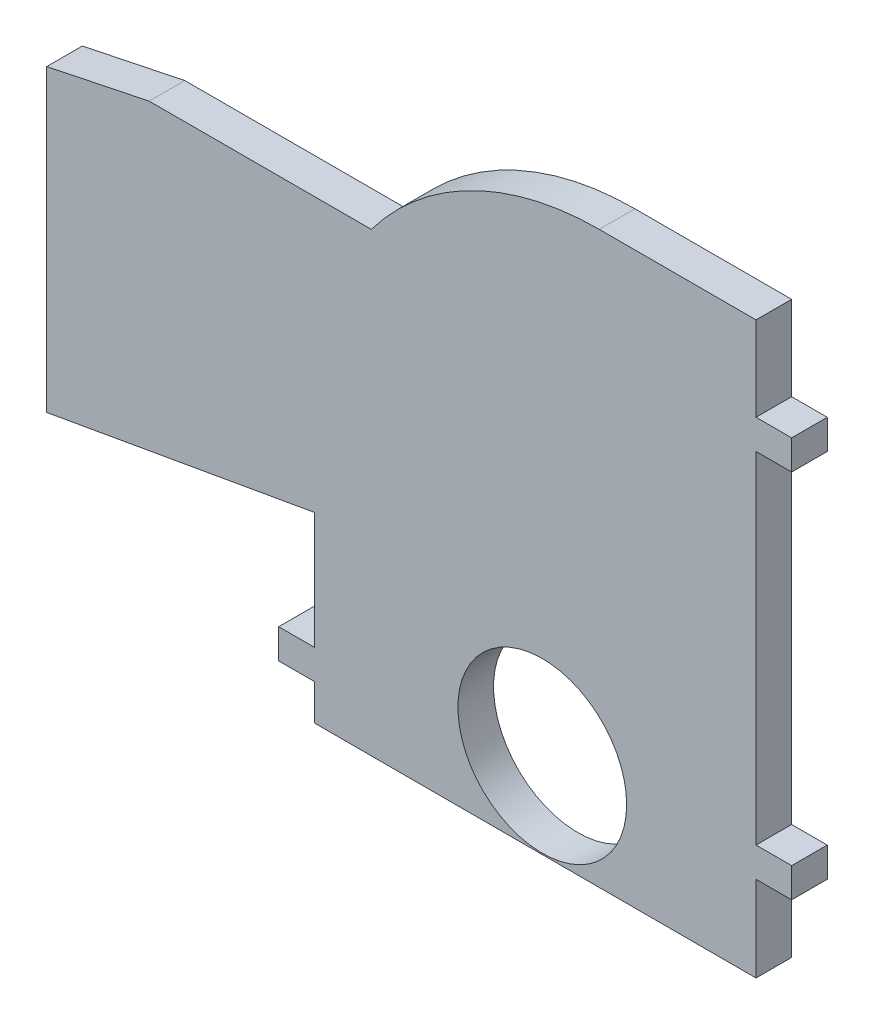
ISO-10303-21;
HEADER;
FILE_DESCRIPTION(('STEP AP214'),'2;1');
FILE_NAME('part.step','',(''),(''),'','','');
FILE_SCHEMA(('AUTOMOTIVE_DESIGN { 1 0 10303 214 1 1 1 1 }'));
ENDSEC;
DATA;
#1=APPLICATION_CONTEXT('core data for automotive mechanical design processes');
#2=APPLICATION_PROTOCOL_DEFINITION('international standard','automotive_design',2000,#1);
#3=PRODUCT_CONTEXT('',#1,'mechanical');
#4=PRODUCT('Part','Part','',(#3));
#5=PRODUCT_RELATED_PRODUCT_CATEGORY('part','',(#4));
#6=PRODUCT_DEFINITION_FORMATION('','',#4);
#7=PRODUCT_DEFINITION_CONTEXT('part definition',#1,'design');
#8=PRODUCT_DEFINITION('design','',#6,#7);
#9=PRODUCT_DEFINITION_SHAPE('','',#8);
#10=(LENGTH_UNIT() NAMED_UNIT(*) SI_UNIT(.MILLI.,.METRE.));
#11=(NAMED_UNIT(*) PLANE_ANGLE_UNIT() SI_UNIT($,.RADIAN.));
#12=(NAMED_UNIT(*) SI_UNIT($,.STERADIAN.) SOLID_ANGLE_UNIT());
#13=UNCERTAINTY_MEASURE_WITH_UNIT(LENGTH_MEASURE(1.E-05),#10,'distance_accuracy_value','');
#14=(GEOMETRIC_REPRESENTATION_CONTEXT(3) GLOBAL_UNCERTAINTY_ASSIGNED_CONTEXT((#13)) GLOBAL_UNIT_ASSIGNED_CONTEXT((#10,
#11,#12)) REPRESENTATION_CONTEXT('',''));
#15=CARTESIAN_POINT('',(0.,0.,0.));
#16=DIRECTION('',(0.,0.,1.));
#17=DIRECTION('',(1.,0.,0.));
#18=AXIS2_PLACEMENT_3D('',#15,#16,#17);
#19=CARTESIAN_POINT('',(-5.14406367786522,21.59,1.5875));
#20=DIRECTION('',(0.,1.,0.));
#21=DIRECTION('',(-1.,0.,0.));
#22=AXIS2_PLACEMENT_3D('',#19,#20,#21);
#23=PLANE('',#22);
#24=DIRECTION('',(1.,0.,0.));
#25=VECTOR('',#24,1.);
#26=CARTESIAN_POINT('',(-5.14406367786522,21.59,0.));
#27=LINE('',#26,#25);
#28=CARTESIAN_POINT('',(2.53999999999987,21.59,0.));
#29=VERTEX_POINT('',#28);
#30=CARTESIAN_POINT('',(9.52499999999987,21.59,0.));
#31=VERTEX_POINT('',#30);
#32=EDGE_CURVE('E213',#29,#31,#27,.T.);
#33=ORIENTED_EDGE('',*,*,#32,.F.);
#34=DIRECTION('',(0.,0.,-1.));
#35=VECTOR('',#34,1.);
#36=CARTESIAN_POINT('',(2.53999999999987,21.59,1.5875));
#37=LINE('',#36,#35);
#38=CARTESIAN_POINT('',(2.53999999999987,21.59,1.5875));
#39=VERTEX_POINT('',#38);
#40=EDGE_CURVE('E11',#39,#29,#37,.T.);
#41=ORIENTED_EDGE('',*,*,#40,.F.);
#42=DIRECTION('',(1.,0.,0.));
#43=VECTOR('',#42,1.);
#44=CARTESIAN_POINT('',(-5.14406367786522,21.59,1.5875));
#45=LINE('',#44,#43);
#46=CARTESIAN_POINT('',(9.52499999999987,21.59,1.5875));
#47=VERTEX_POINT('',#46);
#48=EDGE_CURVE('E394',#39,#47,#45,.T.);
#49=ORIENTED_EDGE('',*,*,#48,.T.);
#50=DIRECTION('',(0.,0.,-1.));
#51=VECTOR('',#50,1.);
#52=CARTESIAN_POINT('',(9.52499999999987,21.59,1.5875));
#53=LINE('',#52,#51);
#54=EDGE_CURVE('E52',#47,#31,#53,.T.);
#55=ORIENTED_EDGE('',*,*,#54,.T.);
#56=EDGE_LOOP('',(#33,#41,#49,#55));
#57=FACE_BOUND('',#56,.T.);
#58=ADVANCED_FACE('F35',(#57),#23,.T.);
#59=CARTESIAN_POINT('',(2.53999999999988,8.89,1.5875));
#60=DIRECTION('',(0.,0.,-1.));
#61=DIRECTION('',(-1.,0.,0.));
#62=AXIS2_PLACEMENT_3D('',#59,#60,#61);
#63=CYLINDRICAL_SURFACE('',#62,12.7);
#64=CARTESIAN_POINT('',(2.53999999999988,8.89,0.));
#65=DIRECTION('',(0.,0.,1.));
#66=DIRECTION('',(1.,0.,0.));
#67=AXIS2_PLACEMENT_3D('',#64,#65,#66);
#68=CIRCLE('',#67,12.7);
#69=CARTESIAN_POINT('',(-7.62000000000013,16.51,0.));
#70=VERTEX_POINT('',#69);
#71=EDGE_CURVE('E215',#29,#70,#68,.T.);
#72=ORIENTED_EDGE('',*,*,#71,.T.);
#73=DIRECTION('',(0.,0.,-1.));
#74=VECTOR('',#73,1.);
#75=CARTESIAN_POINT('',(-7.62000000000013,16.51,1.5875));
#76=LINE('',#75,#74);
#77=CARTESIAN_POINT('',(-7.62000000000013,16.51,1.5875));
#78=VERTEX_POINT('',#77);
#79=EDGE_CURVE('E44',#78,#70,#76,.T.);
#80=ORIENTED_EDGE('',*,*,#79,.F.);
#81=CARTESIAN_POINT('',(2.53999999999988,8.89,1.5875));
#82=DIRECTION('',(0.,0.,1.));
#83=DIRECTION('',(1.,0.,0.));
#84=AXIS2_PLACEMENT_3D('',#81,#82,#83);
#85=CIRCLE('',#84,12.7);
#86=EDGE_CURVE('E396',#39,#78,#85,.T.);
#87=ORIENTED_EDGE('',*,*,#86,.F.);
#88=ORIENTED_EDGE('',*,*,#40,.T.);
#89=EDGE_LOOP('',(#72,#80,#87,#88));
#90=FACE_BOUND('',#89,.T.);
#91=ADVANCED_FACE('F313',(#90),#63,.T.);
#92=CARTESIAN_POINT('',(-5.14406367786526,16.51,1.5875));
#93=DIRECTION('',(0.,-1.,0.));
#94=DIRECTION('',(1.,0.,0.));
#95=AXIS2_PLACEMENT_3D('',#92,#93,#94);
#96=PLANE('',#95);
#97=DIRECTION('',(-1.,0.,0.));
#98=VECTOR('',#97,1.);
#99=CARTESIAN_POINT('',(-5.14406367786526,16.51,0.));
#100=LINE('',#99,#98);
#101=CARTESIAN_POINT('',(-17.5194607595146,16.51,0.));
#102=VERTEX_POINT('',#101);
#103=EDGE_CURVE('E218',#70,#102,#100,.T.);
#104=ORIENTED_EDGE('',*,*,#103,.T.);
#105=DIRECTION('',(0.,0.,-1.));
#106=VECTOR('',#105,1.);
#107=CARTESIAN_POINT('',(-17.5194607595146,16.51,1.5875));
#108=LINE('',#107,#106);
#109=CARTESIAN_POINT('',(-17.5194607595146,16.51,1.5875));
#110=VERTEX_POINT('',#109);
#111=EDGE_CURVE('E301',#110,#102,#108,.T.);
#112=ORIENTED_EDGE('',*,*,#111,.F.);
#113=DIRECTION('',(-1.,0.,0.));
#114=VECTOR('',#113,1.);
#115=CARTESIAN_POINT('',(-5.14406367786526,16.51,1.5875));
#116=LINE('',#115,#114);
#117=EDGE_CURVE('E309',#78,#110,#116,.T.);
#118=ORIENTED_EDGE('',*,*,#117,.F.);
#119=ORIENTED_EDGE('',*,*,#79,.T.);
#120=EDGE_LOOP('',(#104,#112,#118,#119));
#121=FACE_BOUND('',#120,.T.);
#122=ADVANCED_FACE('F306',(#121),#96,.F.);
#123=CARTESIAN_POINT('',(-13.8094341351268,17.2810529858588,1.5875));
#124=DIRECTION('',(0.203481459353994,-0.979078799535139,0.));
#125=DIRECTION('',(0.979078799535139,0.203481459353994,0.));
#126=AXIS2_PLACEMENT_3D('',#123,#124,#125);
#127=PLANE('',#126);
#128=DIRECTION('',(-0.979078799535139,-0.203481459353994,0.));
#129=VECTOR('',#128,1.);
#130=CARTESIAN_POINT('',(-13.8094341351268,17.2810529858588,0.));
#131=LINE('',#130,#129);
#132=CARTESIAN_POINT('',(-22.0849215190291,15.5611625638197,0.));
#133=VERTEX_POINT('',#132);
#134=EDGE_CURVE('E221',#102,#133,#131,.T.);
#135=ORIENTED_EDGE('',*,*,#134,.T.);
#136=DIRECTION('',(0.,0.,-1.));
#137=VECTOR('',#136,1.);
#138=CARTESIAN_POINT('',(-22.0849215190291,15.5611625638197,1.5875));
#139=LINE('',#138,#137);
#140=CARTESIAN_POINT('',(-22.0849215190291,15.5611625638197,1.5875));
#141=VERTEX_POINT('',#140);
#142=EDGE_CURVE('E299',#141,#133,#139,.T.);
#143=ORIENTED_EDGE('',*,*,#142,.F.);
#144=DIRECTION('',(-0.979078799535139,-0.203481459353994,0.));
#145=VECTOR('',#144,1.);
#146=CARTESIAN_POINT('',(-13.8094341351268,17.2810529858588,1.5875));
#147=LINE('',#146,#145);
#148=EDGE_CURVE('E401',#110,#141,#147,.T.);
#149=ORIENTED_EDGE('',*,*,#148,.F.);
#150=ORIENTED_EDGE('',*,*,#111,.T.);
#151=EDGE_LOOP('',(#135,#143,#149,#150));
#152=FACE_BOUND('',#151,.T.);
#153=ADVANCED_FACE('F325',(#152),#127,.F.);
#154=CARTESIAN_POINT('',(-22.0849215190291,-24.4135590527904,1.5875));
#155=DIRECTION('',(-1.,0.,0.));
#156=DIRECTION('',(0.,0.,1.));
#157=AXIS2_PLACEMENT_3D('',#154,#155,#156);
#158=PLANE('',#157);
#159=DIRECTION('',(0.,1.,0.));
#160=VECTOR('',#159,1.);
#161=CARTESIAN_POINT('',(-22.0849215190291,-24.4135590527904,0.));
#162=LINE('',#161,#160);
#163=CARTESIAN_POINT('',(-22.0849215190291,2.21200741234465,0.));
#164=VERTEX_POINT('',#163);
#165=EDGE_CURVE('E224',#164,#133,#162,.T.);
#166=ORIENTED_EDGE('',*,*,#165,.F.);
#167=DIRECTION('',(0.,0.,-1.));
#168=VECTOR('',#167,1.);
#169=CARTESIAN_POINT('',(-22.0849215190291,2.21200741234465,1.5875));
#170=LINE('',#169,#168);
#171=CARTESIAN_POINT('',(-22.0849215190291,2.21200741234465,1.5875));
#172=VERTEX_POINT('',#171);
#173=EDGE_CURVE('E297',#172,#164,#170,.T.);
#174=ORIENTED_EDGE('',*,*,#173,.F.);
#175=DIRECTION('',(0.,1.,0.));
#176=VECTOR('',#175,1.);
#177=CARTESIAN_POINT('',(-22.0849215190291,-24.4135590527904,1.5875));
#178=LINE('',#177,#176);
#179=EDGE_CURVE('E403',#172,#141,#178,.T.);
#180=ORIENTED_EDGE('',*,*,#179,.T.);
#181=ORIENTED_EDGE('',*,*,#142,.T.);
#182=EDGE_LOOP('',(#166,#174,#180,#181));
#183=FACE_BOUND('',#182,.T.);
#184=ADVANCED_FACE('F328',(#183),#158,.T.);
#185=CARTESIAN_POINT('',(-10.2164212357923,4.30803576634235,1.5875));
#186=DIRECTION('',(-0.173913043478261,0.984761013296185,0.));
#187=DIRECTION('',(-0.984761013296185,-0.173913043478261,0.));
#188=AXIS2_PLACEMENT_3D('',#185,#186,#187);
#189=PLANE('',#188);
#190=DIRECTION('',(0.984761013296185,0.173913043478261,0.));
#191=VECTOR('',#190,1.);
#192=CARTESIAN_POINT('',(-10.2164212357923,4.30803576634235,0.));
#193=LINE('',#192,#191);
#194=CARTESIAN_POINT('',(-10.1600000000001,4.31799999999999,0.));
#195=VERTEX_POINT('',#194);
#196=EDGE_CURVE('E227',#164,#195,#193,.T.);
#197=ORIENTED_EDGE('',*,*,#196,.T.);
#198=DIRECTION('',(0.,0.,-1.));
#199=VECTOR('',#198,1.);
#200=CARTESIAN_POINT('',(-10.1600000000001,4.31799999999999,1.5875));
#201=LINE('',#200,#199);
#202=CARTESIAN_POINT('',(-10.1600000000001,4.31799999999999,1.5875));
#203=VERTEX_POINT('',#202);
#204=EDGE_CURVE('E294',#203,#195,#201,.T.);
#205=ORIENTED_EDGE('',*,*,#204,.F.);
#206=DIRECTION('',(0.984761013296185,0.173913043478261,0.));
#207=VECTOR('',#206,1.);
#208=CARTESIAN_POINT('',(-10.2164212357923,4.30803576634235,1.5875));
#209=LINE('',#208,#207);
#210=EDGE_CURVE('E406',#172,#203,#209,.T.);
#211=ORIENTED_EDGE('',*,*,#210,.F.);
#212=ORIENTED_EDGE('',*,*,#173,.T.);
#213=EDGE_LOOP('',(#197,#205,#211,#212));
#214=FACE_BOUND('',#213,.T.);
#215=ADVANCED_FACE('F332',(#214),#189,.F.);
#216=CARTESIAN_POINT('',(-10.1600000000001,-24.4135590527904,1.5875));
#217=DIRECTION('',(1.,0.,0.));
#218=DIRECTION('',(0.,1.,0.));
#219=AXIS2_PLACEMENT_3D('',#216,#217,#218);
#220=PLANE('',#219);
#221=DIRECTION('',(0.,-1.,0.));
#222=VECTOR('',#221,1.);
#223=CARTESIAN_POINT('',(-10.1600000000001,-24.4135590527904,0.));
#224=LINE('',#223,#222);
#225=CARTESIAN_POINT('',(-10.1600000000001,-0.889000000000001,0.));
#226=VERTEX_POINT('',#225);
#227=EDGE_CURVE('E230',#195,#226,#224,.T.);
#228=ORIENTED_EDGE('',*,*,#227,.T.);
#229=DIRECTION('',(0.,0.,-1.));
#230=VECTOR('',#229,1.);
#231=CARTESIAN_POINT('',(-10.1600000000001,-0.889000000000001,1.5875));
#232=LINE('',#231,#230);
#233=CARTESIAN_POINT('',(-10.1600000000001,-0.889000000000001,1.5875));
#234=VERTEX_POINT('',#233);
#235=EDGE_CURVE('E292',#234,#226,#232,.T.);
#236=ORIENTED_EDGE('',*,*,#235,.F.);
#237=DIRECTION('',(0.,-1.,0.));
#238=VECTOR('',#237,1.);
#239=CARTESIAN_POINT('',(-10.1600000000001,-24.4135590527904,1.5875));
#240=LINE('',#239,#238);
#241=EDGE_CURVE('E409',#203,#234,#240,.T.);
#242=ORIENTED_EDGE('',*,*,#241,.F.);
#243=ORIENTED_EDGE('',*,*,#204,.T.);
#244=EDGE_LOOP('',(#228,#236,#242,#243));
#245=FACE_BOUND('',#244,.T.);
#246=ADVANCED_FACE('F336',(#245),#220,.F.);
#247=CARTESIAN_POINT('',(-5.14406367786524,-0.889000000000001,1.5875));
#248=DIRECTION('',(0.,1.,0.));
#249=DIRECTION('',(-1.,0.,0.));
#250=AXIS2_PLACEMENT_3D('',#247,#248,#249);
#251=PLANE('',#250);
#252=DIRECTION('',(1.,0.,0.));
#253=VECTOR('',#252,1.);
#254=CARTESIAN_POINT('',(-5.14406367786524,-0.889000000000001,0.));
#255=LINE('',#254,#253);
#256=CARTESIAN_POINT('',(-11.7475000000001,-0.889000000000001,0.));
#257=VERTEX_POINT('',#256);
#258=EDGE_CURVE('E233',#257,#226,#255,.T.);
#259=ORIENTED_EDGE('',*,*,#258,.F.);
#260=DIRECTION('',(0.,0.,-1.));
#261=VECTOR('',#260,1.);
#262=CARTESIAN_POINT('',(-11.7475000000001,-0.889000000000001,1.5875));
#263=LINE('',#262,#261);
#264=CARTESIAN_POINT('',(-11.7475000000001,-0.889000000000001,1.5875));
#265=VERTEX_POINT('',#264);
#266=EDGE_CURVE('E290',#265,#257,#263,.T.);
#267=ORIENTED_EDGE('',*,*,#266,.F.);
#268=DIRECTION('',(1.,0.,0.));
#269=VECTOR('',#268,1.);
#270=CARTESIAN_POINT('',(-5.14406367786524,-0.889000000000001,1.5875));
#271=LINE('',#270,#269);
#272=EDGE_CURVE('E411',#265,#234,#271,.T.);
#273=ORIENTED_EDGE('',*,*,#272,.T.);
#274=ORIENTED_EDGE('',*,*,#235,.T.);
#275=EDGE_LOOP('',(#259,#267,#273,#274));
#276=FACE_BOUND('',#275,.T.);
#277=ADVANCED_FACE('F338',(#276),#251,.T.);
#278=CARTESIAN_POINT('',(-11.7475000000001,-24.4135590527904,1.5875));
#279=DIRECTION('',(-1.,0.,0.));
#280=DIRECTION('',(0.,-1.,0.));
#281=AXIS2_PLACEMENT_3D('',#278,#279,#280);
#282=PLANE('',#281);
#283=DIRECTION('',(0.,1.,0.));
#284=VECTOR('',#283,1.);
#285=CARTESIAN_POINT('',(-11.7475000000001,-24.4135590527904,0.));
#286=LINE('',#285,#284);
#287=CARTESIAN_POINT('',(-11.7475000000001,-2.2098,0.));
#288=VERTEX_POINT('',#287);
#289=EDGE_CURVE('E237',#288,#257,#286,.T.);
#290=ORIENTED_EDGE('',*,*,#289,.F.);
#291=DIRECTION('',(0.,0.,-1.));
#292=VECTOR('',#291,1.);
#293=CARTESIAN_POINT('',(-11.7475000000001,-2.2098,1.5875));
#294=LINE('',#293,#292);
#295=CARTESIAN_POINT('',(-11.7475000000001,-2.2098,1.5875));
#296=VERTEX_POINT('',#295);
#297=EDGE_CURVE('E288',#296,#288,#294,.T.);
#298=ORIENTED_EDGE('',*,*,#297,.F.);
#299=DIRECTION('',(0.,1.,0.));
#300=VECTOR('',#299,1.);
#301=CARTESIAN_POINT('',(-11.7475000000001,-24.4135590527904,1.5875));
#302=LINE('',#301,#300);
#303=EDGE_CURVE('E415',#296,#265,#302,.T.);
#304=ORIENTED_EDGE('',*,*,#303,.T.);
#305=ORIENTED_EDGE('',*,*,#266,.T.);
#306=EDGE_LOOP('',(#290,#298,#304,#305));
#307=FACE_BOUND('',#306,.T.);
#308=ADVANCED_FACE('F341',(#307),#282,.T.);
#309=CARTESIAN_POINT('',(-5.14406367786524,-2.2098,1.5875));
#310=DIRECTION('',(0.,1.,0.));
#311=DIRECTION('',(0.,0.,1.));
#312=AXIS2_PLACEMENT_3D('',#309,#310,#311);
#313=PLANE('',#312);
#314=DIRECTION('',(1.,0.,0.));
#315=VECTOR('',#314,1.);
#316=CARTESIAN_POINT('',(-5.14406367786524,-2.2098,0.));
#317=LINE('',#316,#315);
#318=CARTESIAN_POINT('',(-10.1600000000001,-2.2098,0.));
#319=VERTEX_POINT('',#318);
#320=EDGE_CURVE('E240',#288,#319,#317,.T.);
#321=ORIENTED_EDGE('',*,*,#320,.T.);
#322=DIRECTION('',(0.,0.,-1.));
#323=VECTOR('',#322,1.);
#324=CARTESIAN_POINT('',(-10.1600000000001,-2.2098,1.5875));
#325=LINE('',#324,#323);
#326=CARTESIAN_POINT('',(-10.1600000000001,-2.2098,1.5875));
#327=VERTEX_POINT('',#326);
#328=EDGE_CURVE('E285',#327,#319,#325,.T.);
#329=ORIENTED_EDGE('',*,*,#328,.F.);
#330=DIRECTION('',(1.,0.,0.));
#331=VECTOR('',#330,1.);
#332=CARTESIAN_POINT('',(-5.14406367786524,-2.2098,1.5875));
#333=LINE('',#332,#331);
#334=EDGE_CURVE('E418',#296,#327,#333,.T.);
#335=ORIENTED_EDGE('',*,*,#334,.F.);
#336=ORIENTED_EDGE('',*,*,#297,.T.);
#337=EDGE_LOOP('',(#321,#329,#335,#336));
#338=FACE_BOUND('',#337,.T.);
#339=ADVANCED_FACE('F345',(#338),#313,.F.);
#340=CARTESIAN_POINT('',(-10.1600000000001,-3.81,0.));
#341=VERTEX_POINT('',#340);
#342=EDGE_CURVE('E234',#319,#341,#224,.T.);
#343=ORIENTED_EDGE('',*,*,#342,.T.);
#344=DIRECTION('',(0.,0.,-1.));
#345=VECTOR('',#344,1.);
#346=CARTESIAN_POINT('',(-10.1600000000001,-3.81,1.5875));
#347=LINE('',#346,#345);
#348=CARTESIAN_POINT('',(-10.1600000000001,-3.81,1.5875));
#349=VERTEX_POINT('',#348);
#350=EDGE_CURVE('E282',#349,#341,#347,.T.);
#351=ORIENTED_EDGE('',*,*,#350,.F.);
#352=EDGE_CURVE('E412',#327,#349,#240,.T.);
#353=ORIENTED_EDGE('',*,*,#352,.F.);
#354=ORIENTED_EDGE('',*,*,#328,.T.);
#355=EDGE_LOOP('',(#343,#351,#353,#354));
#356=FACE_BOUND('',#355,.T.);
#357=ADVANCED_FACE('F349',(#356),#220,.F.);
#358=CARTESIAN_POINT('',(-5.14406367786524,-3.81,1.5875));
#359=DIRECTION('',(0.,1.,0.));
#360=DIRECTION('',(0.,0.,1.));
#361=AXIS2_PLACEMENT_3D('',#358,#359,#360);
#362=PLANE('',#361);
#363=DIRECTION('',(1.,0.,0.));
#364=VECTOR('',#363,1.);
#365=CARTESIAN_POINT('',(-5.14406367786524,-3.81,0.));
#366=LINE('',#365,#364);
#367=CARTESIAN_POINT('',(9.52499999999988,-3.81,0.));
#368=VERTEX_POINT('',#367);
#369=EDGE_CURVE('E243',#341,#368,#366,.T.);
#370=ORIENTED_EDGE('',*,*,#369,.T.);
#371=DIRECTION('',(0.,0.,-1.));
#372=VECTOR('',#371,1.);
#373=CARTESIAN_POINT('',(9.52499999999988,-3.81,1.5875));
#374=LINE('',#373,#372);
#375=CARTESIAN_POINT('',(9.52499999999988,-3.81,1.5875));
#376=VERTEX_POINT('',#375);
#377=EDGE_CURVE('E280',#376,#368,#374,.T.);
#378=ORIENTED_EDGE('',*,*,#377,.F.);
#379=DIRECTION('',(1.,0.,0.));
#380=VECTOR('',#379,1.);
#381=CARTESIAN_POINT('',(-5.14406367786524,-3.81,1.5875));
#382=LINE('',#381,#380);
#383=EDGE_CURVE('E421',#349,#376,#382,.T.);
#384=ORIENTED_EDGE('',*,*,#383,.F.);
#385=ORIENTED_EDGE('',*,*,#350,.T.);
#386=EDGE_LOOP('',(#370,#378,#384,#385));
#387=FACE_BOUND('',#386,.T.);
#388=ADVANCED_FACE('F353',(#387),#362,.F.);
#389=CARTESIAN_POINT('',(9.52499999999989,-24.4135590527904,1.5875));
#390=DIRECTION('',(1.,0.,0.));
#391=DIRECTION('',(0.,1.,0.));
#392=AXIS2_PLACEMENT_3D('',#389,#390,#391);
#393=PLANE('',#392);
#394=DIRECTION('',(0.,-1.,0.));
#395=VECTOR('',#394,1.);
#396=CARTESIAN_POINT('',(9.52499999999989,-24.4135590527904,0.));
#397=LINE('',#396,#395);
#398=CARTESIAN_POINT('',(9.52499999999988,0.,0.));
#399=VERTEX_POINT('',#398);
#400=EDGE_CURVE('E246',#399,#368,#397,.T.);
#401=ORIENTED_EDGE('',*,*,#400,.F.);
#402=DIRECTION('',(0.,0.,-1.));
#403=VECTOR('',#402,1.);
#404=CARTESIAN_POINT('',(9.52499999999988,0.,1.5875));
#405=LINE('',#404,#403);
#406=CARTESIAN_POINT('',(9.52499999999988,0.,1.5875));
#407=VERTEX_POINT('',#406);
#408=EDGE_CURVE('E278',#407,#399,#405,.T.);
#409=ORIENTED_EDGE('',*,*,#408,.F.);
#410=DIRECTION('',(0.,-1.,0.));
#411=VECTOR('',#410,1.);
#412=CARTESIAN_POINT('',(9.52499999999989,-24.4135590527904,1.5875));
#413=LINE('',#412,#411);
#414=EDGE_CURVE('E207',#407,#376,#413,.T.);
#415=ORIENTED_EDGE('',*,*,#414,.T.);
#416=ORIENTED_EDGE('',*,*,#377,.T.);
#417=EDGE_LOOP('',(#401,#409,#415,#416));
#418=FACE_BOUND('',#417,.T.);
#419=ADVANCED_FACE('F357',(#418),#393,.T.);
#420=CARTESIAN_POINT('',(-5.14406367786524,0.,1.5875));
#421=DIRECTION('',(0.,1.,0.));
#422=DIRECTION('',(-1.,0.,0.));
#423=AXIS2_PLACEMENT_3D('',#420,#421,#422);
#424=PLANE('',#423);
#425=DIRECTION('',(1.,0.,0.));
#426=VECTOR('',#425,1.);
#427=CARTESIAN_POINT('',(-5.14406367786524,0.,0.));
#428=LINE('',#427,#426);
#429=CARTESIAN_POINT('',(11.1124999999999,0.,0.));
#430=VERTEX_POINT('',#429);
#431=EDGE_CURVE('E249',#399,#430,#428,.T.);
#432=ORIENTED_EDGE('',*,*,#431,.T.);
#433=DIRECTION('',(0.,0.,-1.));
#434=VECTOR('',#433,1.);
#435=CARTESIAN_POINT('',(11.1124999999999,0.,1.5875));
#436=LINE('',#435,#434);
#437=CARTESIAN_POINT('',(11.1124999999999,0.,1.5875));
#438=VERTEX_POINT('',#437);
#439=EDGE_CURVE('E275',#438,#430,#436,.T.);
#440=ORIENTED_EDGE('',*,*,#439,.F.);
#441=DIRECTION('',(1.,0.,0.));
#442=VECTOR('',#441,1.);
#443=CARTESIAN_POINT('',(-5.14406367786524,0.,1.5875));
#444=LINE('',#443,#442);
#445=EDGE_CURVE('E424',#407,#438,#444,.T.);
#446=ORIENTED_EDGE('',*,*,#445,.F.);
#447=ORIENTED_EDGE('',*,*,#408,.T.);
#448=EDGE_LOOP('',(#432,#440,#446,#447));
#449=FACE_BOUND('',#448,.T.);
#450=ADVANCED_FACE('F359',(#449),#424,.F.);
#451=CARTESIAN_POINT('',(11.1124999999998,-24.4135590527904,1.5875));
#452=DIRECTION('',(-1.,0.,0.));
#453=DIRECTION('',(0.,-1.,0.));
#454=AXIS2_PLACEMENT_3D('',#451,#452,#453);
#455=PLANE('',#454);
#456=DIRECTION('',(0.,1.,0.));
#457=VECTOR('',#456,1.);
#458=CARTESIAN_POINT('',(11.1124999999998,-24.4135590527904,0.));
#459=LINE('',#458,#457);
#460=CARTESIAN_POINT('',(11.1124999999999,1.3208,0.));
#461=VERTEX_POINT('',#460);
#462=EDGE_CURVE('E254',#430,#461,#459,.T.);
#463=ORIENTED_EDGE('',*,*,#462,.T.);
#464=DIRECTION('',(0.,0.,-1.));
#465=VECTOR('',#464,1.);
#466=CARTESIAN_POINT('',(11.1124999999999,1.3208,1.5875));
#467=LINE('',#466,#465);
#468=CARTESIAN_POINT('',(11.1124999999999,1.3208,1.5875));
#469=VERTEX_POINT('',#468);
#470=EDGE_CURVE('E273',#469,#461,#467,.T.);
#471=ORIENTED_EDGE('',*,*,#470,.F.);
#472=DIRECTION('',(0.,1.,0.));
#473=VECTOR('',#472,1.);
#474=CARTESIAN_POINT('',(11.1124999999998,-24.4135590527904,1.5875));
#475=LINE('',#474,#473);
#476=EDGE_CURVE('E427',#438,#469,#475,.T.);
#477=ORIENTED_EDGE('',*,*,#476,.F.);
#478=ORIENTED_EDGE('',*,*,#439,.T.);
#479=EDGE_LOOP('',(#463,#471,#477,#478));
#480=FACE_BOUND('',#479,.T.);
#481=ADVANCED_FACE('F362',(#480),#455,.F.);
#482=CARTESIAN_POINT('',(-5.14406367786524,1.3208,1.5875));
#483=DIRECTION('',(0.,1.,0.));
#484=DIRECTION('',(-1.,0.,0.));
#485=AXIS2_PLACEMENT_3D('',#482,#483,#484);
#486=PLANE('',#485);
#487=DIRECTION('',(1.,0.,0.));
#488=VECTOR('',#487,1.);
#489=CARTESIAN_POINT('',(-5.14406367786524,1.3208,0.));
#490=LINE('',#489,#488);
#491=CARTESIAN_POINT('',(9.52499999999988,1.3208,0.));
#492=VERTEX_POINT('',#491);
#493=EDGE_CURVE('E257',#492,#461,#490,.T.);
#494=ORIENTED_EDGE('',*,*,#493,.F.);
#495=DIRECTION('',(0.,0.,-1.));
#496=VECTOR('',#495,1.);
#497=CARTESIAN_POINT('',(9.52499999999988,1.3208,1.5875));
#498=LINE('',#497,#496);
#499=CARTESIAN_POINT('',(9.52499999999988,1.3208,1.5875));
#500=VERTEX_POINT('',#499);
#501=EDGE_CURVE('E271',#500,#492,#498,.T.);
#502=ORIENTED_EDGE('',*,*,#501,.F.);
#503=DIRECTION('',(1.,0.,0.));
#504=VECTOR('',#503,1.);
#505=CARTESIAN_POINT('',(-5.14406367786524,1.3208,1.5875));
#506=LINE('',#505,#504);
#507=EDGE_CURVE('E429',#500,#469,#506,.T.);
#508=ORIENTED_EDGE('',*,*,#507,.T.);
#509=ORIENTED_EDGE('',*,*,#470,.T.);
#510=EDGE_LOOP('',(#494,#502,#508,#509));
#511=FACE_BOUND('',#510,.T.);
#512=ADVANCED_FACE('F366',(#511),#486,.T.);
#513=CARTESIAN_POINT('',(9.52499999999985,16.51,0.));
#514=VERTEX_POINT('',#513);
#515=EDGE_CURVE('E251',#514,#492,#397,.T.);
#516=ORIENTED_EDGE('',*,*,#515,.F.);
#517=DIRECTION('',(0.,0.,-1.));
#518=VECTOR('',#517,1.);
#519=CARTESIAN_POINT('',(9.52499999999985,16.51,1.5875));
#520=LINE('',#519,#518);
#521=CARTESIAN_POINT('',(9.52499999999985,16.51,1.5875));
#522=VERTEX_POINT('',#521);
#523=EDGE_CURVE('E269',#522,#514,#520,.T.);
#524=ORIENTED_EDGE('',*,*,#523,.F.);
#525=EDGE_CURVE('E206',#522,#500,#413,.T.);
#526=ORIENTED_EDGE('',*,*,#525,.T.);
#527=ORIENTED_EDGE('',*,*,#501,.T.);
#528=EDGE_LOOP('',(#516,#524,#526,#527));
#529=FACE_BOUND('',#528,.T.);
#530=ADVANCED_FACE('F370',(#529),#393,.T.);
#531=CARTESIAN_POINT('',(-5.14406367786524,16.51,1.5875));
#532=DIRECTION('',(0.,1.,0.));
#533=DIRECTION('',(0.,0.,1.));
#534=AXIS2_PLACEMENT_3D('',#531,#532,#533);
#535=PLANE('',#534);
#536=DIRECTION('',(1.,0.,0.));
#537=VECTOR('',#536,1.);
#538=CARTESIAN_POINT('',(-5.14406367786524,16.51,0.));
#539=LINE('',#538,#537);
#540=CARTESIAN_POINT('',(11.1124999999999,16.51,0.));
#541=VERTEX_POINT('',#540);
#542=EDGE_CURVE('E260',#514,#541,#539,.T.);
#543=ORIENTED_EDGE('',*,*,#542,.T.);
#544=DIRECTION('',(0.,0.,-1.));
#545=VECTOR('',#544,1.);
#546=CARTESIAN_POINT('',(11.1124999999999,16.51,1.5875));
#547=LINE('',#546,#545);
#548=CARTESIAN_POINT('',(11.1124999999999,16.51,1.5875));
#549=VERTEX_POINT('',#548);
#550=EDGE_CURVE('E200',#549,#541,#547,.T.);
#551=ORIENTED_EDGE('',*,*,#550,.F.);
#552=DIRECTION('',(1.,0.,0.));
#553=VECTOR('',#552,1.);
#554=CARTESIAN_POINT('',(-5.14406367786524,16.51,1.5875));
#555=LINE('',#554,#553);
#556=EDGE_CURVE('E189',#522,#549,#555,.T.);
#557=ORIENTED_EDGE('',*,*,#556,.F.);
#558=ORIENTED_EDGE('',*,*,#523,.T.);
#559=EDGE_LOOP('',(#543,#551,#557,#558));
#560=FACE_BOUND('',#559,.T.);
#561=ADVANCED_FACE('F372',(#560),#535,.F.);
#562=CARTESIAN_POINT('',(11.1124999999993,-24.4135590527907,1.5875));
#563=DIRECTION('',(-1.,0.,0.));
#564=DIRECTION('',(0.,-1.,0.));
#565=AXIS2_PLACEMENT_3D('',#562,#563,#564);
#566=PLANE('',#565);
#567=DIRECTION('',(0.,1.,0.));
#568=VECTOR('',#567,1.);
#569=CARTESIAN_POINT('',(11.1124999999993,-24.4135590527907,0.));
#570=LINE('',#569,#568);
#571=CARTESIAN_POINT('',(11.1124999999999,17.8308,0.));
#572=VERTEX_POINT('',#571);
#573=EDGE_CURVE('E197',#541,#572,#570,.T.);
#574=ORIENTED_EDGE('',*,*,#573,.T.);
#575=DIRECTION('',(0.,0.,-1.));
#576=VECTOR('',#575,1.);
#577=CARTESIAN_POINT('',(11.1124999999999,17.8308,1.5875));
#578=LINE('',#577,#576);
#579=CARTESIAN_POINT('',(11.1124999999999,17.8308,1.5875));
#580=VERTEX_POINT('',#579);
#581=EDGE_CURVE('E195',#580,#572,#578,.T.);
#582=ORIENTED_EDGE('',*,*,#581,.F.);
#583=DIRECTION('',(0.,1.,0.));
#584=VECTOR('',#583,1.);
#585=CARTESIAN_POINT('',(11.1124999999993,-24.4135590527907,1.5875));
#586=LINE('',#585,#584);
#587=EDGE_CURVE('E180',#549,#580,#586,.T.);
#588=ORIENTED_EDGE('',*,*,#587,.F.);
#589=ORIENTED_EDGE('',*,*,#550,.T.);
#590=EDGE_LOOP('',(#574,#582,#588,#589));
#591=FACE_BOUND('',#590,.T.);
#592=ADVANCED_FACE('F196',(#591),#566,.F.);
#593=CARTESIAN_POINT('',(-5.14406367786524,17.8308,1.5875));
#594=DIRECTION('',(0.,1.,0.));
#595=DIRECTION('',(0.,0.,1.));
#596=AXIS2_PLACEMENT_3D('',#593,#594,#595);
#597=PLANE('',#596);
#598=DIRECTION('',(1.,0.,0.));
#599=VECTOR('',#598,1.);
#600=CARTESIAN_POINT('',(-5.14406367786524,17.8308,0.));
#601=LINE('',#600,#599);
#602=CARTESIAN_POINT('',(9.52499999999987,17.8308,0.));
#603=VERTEX_POINT('',#602);
#604=EDGE_CURVE('E264',#603,#572,#601,.T.);
#605=ORIENTED_EDGE('',*,*,#604,.F.);
#606=DIRECTION('',(0.,0.,-1.));
#607=VECTOR('',#606,1.);
#608=CARTESIAN_POINT('',(9.52499999999987,17.8308,1.5875));
#609=LINE('',#608,#607);
#610=CARTESIAN_POINT('',(9.52499999999987,17.8308,1.5875));
#611=VERTEX_POINT('',#610);
#612=EDGE_CURVE('E116',#611,#603,#609,.T.);
#613=ORIENTED_EDGE('',*,*,#612,.F.);
#614=DIRECTION('',(1.,0.,0.));
#615=VECTOR('',#614,1.);
#616=CARTESIAN_POINT('',(-5.14406367786524,17.8308,1.5875));
#617=LINE('',#616,#615);
#618=EDGE_CURVE('E186',#611,#580,#617,.T.);
#619=ORIENTED_EDGE('',*,*,#618,.T.);
#620=ORIENTED_EDGE('',*,*,#581,.T.);
#621=EDGE_LOOP('',(#605,#613,#619,#620));
#622=FACE_BOUND('',#621,.T.);
#623=ADVANCED_FACE('F202',(#622),#597,.T.);
#624=CARTESIAN_POINT('',(0.,0.,1.5875));
#625=DIRECTION('',(0.,0.,-1.));
#626=DIRECTION('',(-1.,0.,0.));
#627=AXIS2_PLACEMENT_3D('',#624,#625,#626);
#628=CYLINDRICAL_SURFACE('',#627,3.7592);
#629=CARTESIAN_POINT('',(0.,0.,1.5875));
#630=DIRECTION('',(0.,0.,1.));
#631=DIRECTION('',(1.,0.,0.));
#632=AXIS2_PLACEMENT_3D('',#629,#630,#631);
#633=CIRCLE('',#632,3.7592);
#634=CARTESIAN_POINT('',(3.7592,0.,1.5875));
#635=VERTEX_POINT('',#634);
#636=EDGE_CURVE('E392',#635,#635,#633,.T.);
#637=ORIENTED_EDGE('',*,*,#636,.T.);
#638=EDGE_LOOP('',(#637));
#639=FACE_BOUND('',#638,.T.);
#640=CARTESIAN_POINT('',(0.,0.,0.));
#641=DIRECTION('',(0.,0.,1.));
#642=DIRECTION('',(1.,0.,0.));
#643=AXIS2_PLACEMENT_3D('',#640,#641,#642);
#644=CIRCLE('',#643,3.7592);
#645=CARTESIAN_POINT('',(3.7592,0.,0.));
#646=VERTEX_POINT('',#645);
#647=EDGE_CURVE('E210',#646,#646,#644,.T.);
#648=ORIENTED_EDGE('',*,*,#647,.F.);
#649=EDGE_LOOP('',(#648));
#650=FACE_BOUND('',#649,.T.);
#651=ADVANCED_FACE('F37',(#639,#650),#628,.F.);
#652=EDGE_CURVE('E250',#31,#603,#397,.T.);
#653=ORIENTED_EDGE('',*,*,#652,.F.);
#654=ORIENTED_EDGE('',*,*,#54,.F.);
#655=EDGE_CURVE('E203',#47,#611,#413,.T.);
#656=ORIENTED_EDGE('',*,*,#655,.T.);
#657=ORIENTED_EDGE('',*,*,#612,.T.);
#658=EDGE_LOOP('',(#653,#654,#656,#657));
#659=FACE_BOUND('',#658,.T.);
#660=ADVANCED_FACE('F380',(#659),#393,.T.);
#661=CARTESIAN_POINT('',(-5.14406367786524,-24.4135590527904,1.5875));
#662=DIRECTION('',(0.,0.,1.));
#663=DIRECTION('',(1.,0.,0.));
#664=AXIS2_PLACEMENT_3D('',#661,#662,#663);
#665=PLANE('',#664);
#666=ORIENTED_EDGE('',*,*,#636,.F.);
#667=EDGE_LOOP('',(#666));
#668=FACE_BOUND('',#667,.T.);
#669=ORIENTED_EDGE('',*,*,#48,.F.);
#670=ORIENTED_EDGE('',*,*,#86,.T.);
#671=ORIENTED_EDGE('',*,*,#117,.T.);
#672=ORIENTED_EDGE('',*,*,#148,.T.);
#673=ORIENTED_EDGE('',*,*,#179,.F.);
#674=ORIENTED_EDGE('',*,*,#210,.T.);
#675=ORIENTED_EDGE('',*,*,#241,.T.);
#676=ORIENTED_EDGE('',*,*,#272,.F.);
#677=ORIENTED_EDGE('',*,*,#303,.F.);
#678=ORIENTED_EDGE('',*,*,#334,.T.);
#679=ORIENTED_EDGE('',*,*,#352,.T.);
#680=ORIENTED_EDGE('',*,*,#383,.T.);
#681=ORIENTED_EDGE('',*,*,#414,.F.);
#682=ORIENTED_EDGE('',*,*,#445,.T.);
#683=ORIENTED_EDGE('',*,*,#476,.T.);
#684=ORIENTED_EDGE('',*,*,#507,.F.);
#685=ORIENTED_EDGE('',*,*,#525,.F.);
#686=ORIENTED_EDGE('',*,*,#556,.T.);
#687=ORIENTED_EDGE('',*,*,#587,.T.);
#688=ORIENTED_EDGE('',*,*,#618,.F.);
#689=ORIENTED_EDGE('',*,*,#655,.F.);
#690=EDGE_LOOP('',(#669,#670,#671,#672,#673,#674,#675,#676,#677,#678,#679,#680,#681,#682,#683,
#684,#685,#686,#687,#688,#689));
#691=FACE_BOUND('',#690,.T.);
#692=ADVANCED_FACE('F183',(#668,#691),#665,.T.);
#693=CARTESIAN_POINT('',(-5.14406367786524,-24.4135590527904,0.));
#694=DIRECTION('',(0.,0.,1.));
#695=DIRECTION('',(1.,0.,0.));
#696=AXIS2_PLACEMENT_3D('',#693,#694,#695);
#697=PLANE('',#696);
#698=ORIENTED_EDGE('',*,*,#647,.T.);
#699=EDGE_LOOP('',(#698));
#700=FACE_BOUND('',#699,.T.);
#701=ORIENTED_EDGE('',*,*,#32,.T.);
#702=ORIENTED_EDGE('',*,*,#652,.T.);
#703=ORIENTED_EDGE('',*,*,#604,.T.);
#704=ORIENTED_EDGE('',*,*,#573,.F.);
#705=ORIENTED_EDGE('',*,*,#542,.F.);
#706=ORIENTED_EDGE('',*,*,#515,.T.);
#707=ORIENTED_EDGE('',*,*,#493,.T.);
#708=ORIENTED_EDGE('',*,*,#462,.F.);
#709=ORIENTED_EDGE('',*,*,#431,.F.);
#710=ORIENTED_EDGE('',*,*,#400,.T.);
#711=ORIENTED_EDGE('',*,*,#369,.F.);
#712=ORIENTED_EDGE('',*,*,#342,.F.);
#713=ORIENTED_EDGE('',*,*,#320,.F.);
#714=ORIENTED_EDGE('',*,*,#289,.T.);
#715=ORIENTED_EDGE('',*,*,#258,.T.);
#716=ORIENTED_EDGE('',*,*,#227,.F.);
#717=ORIENTED_EDGE('',*,*,#196,.F.);
#718=ORIENTED_EDGE('',*,*,#165,.T.);
#719=ORIENTED_EDGE('',*,*,#134,.F.);
#720=ORIENTED_EDGE('',*,*,#103,.F.);
#721=ORIENTED_EDGE('',*,*,#71,.F.);
#722=EDGE_LOOP('',(#701,#702,#703,#704,#705,#706,#707,#708,#709,#710,#711,#712,#713,#714,#715,
#716,#717,#718,#719,#720,#721));
#723=FACE_BOUND('',#722,.T.);
#724=ADVANCED_FACE('F315',(#700,#723),#697,.F.);
#725=CLOSED_SHELL('',(#58,#91,#122,#153,#184,#215,#246,#277,#308,#339,#357,#388,#419,#450,#481,
#512,#530,#561,#592,#623,#651,#660,#692,#724));
#726=MANIFOLD_SOLID_BREP('B2',#725);
#727=ADVANCED_BREP_SHAPE_REPRESENTATION('',(#18,#726),#14);
#728=SHAPE_DEFINITION_REPRESENTATION(#9,#727);
ENDSEC;
END-ISO-10303-21;
